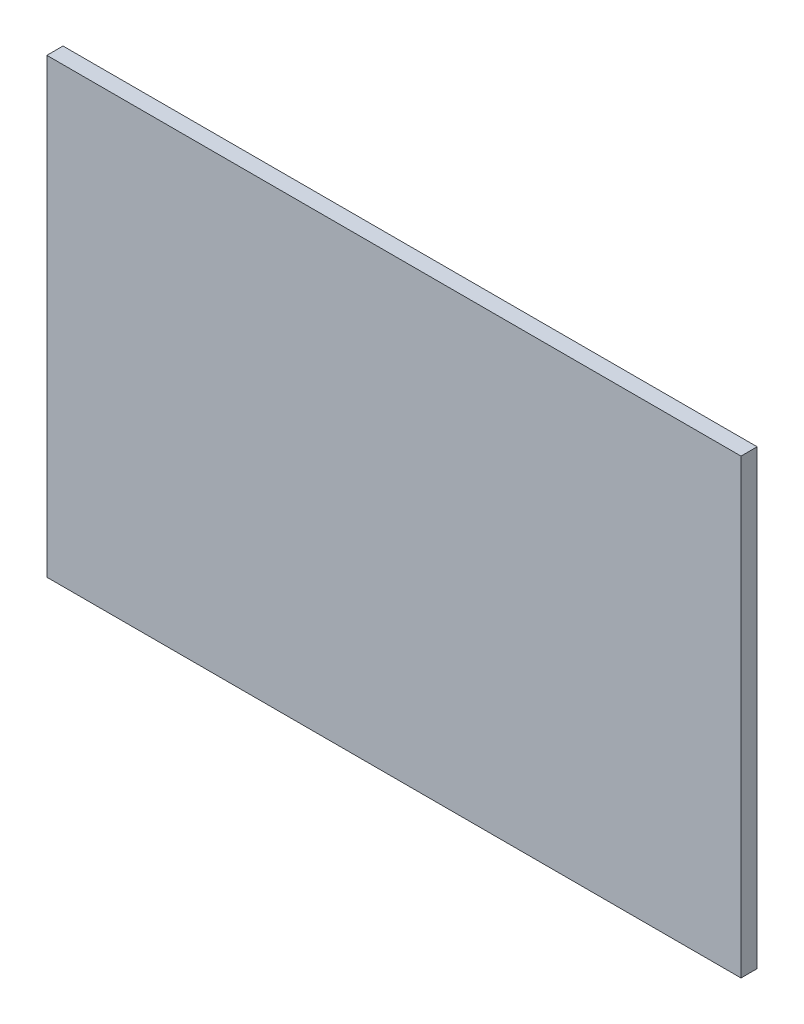
ISO-10303-21;
HEADER;
FILE_DESCRIPTION(('STEP AP214'),'2;1');
FILE_NAME('part.step','',(''),(''),'','','');
FILE_SCHEMA(('AUTOMOTIVE_DESIGN { 1 0 10303 214 1 1 1 1 }'));
ENDSEC;
DATA;
#1=APPLICATION_CONTEXT('core data for automotive mechanical design processes');
#2=APPLICATION_PROTOCOL_DEFINITION('international standard','automotive_design',2000,#1);
#3=PRODUCT_CONTEXT('',#1,'mechanical');
#4=PRODUCT('Part','Part','',(#3));
#5=PRODUCT_RELATED_PRODUCT_CATEGORY('part','',(#4));
#6=PRODUCT_DEFINITION_FORMATION('','',#4);
#7=PRODUCT_DEFINITION_CONTEXT('part definition',#1,'design');
#8=PRODUCT_DEFINITION('design','',#6,#7);
#9=PRODUCT_DEFINITION_SHAPE('','',#8);
#10=(LENGTH_UNIT() NAMED_UNIT(*) SI_UNIT(.MILLI.,.METRE.));
#11=(NAMED_UNIT(*) PLANE_ANGLE_UNIT() SI_UNIT($,.RADIAN.));
#12=(NAMED_UNIT(*) SI_UNIT($,.STERADIAN.) SOLID_ANGLE_UNIT());
#13=UNCERTAINTY_MEASURE_WITH_UNIT(LENGTH_MEASURE(1.E-05),#10,'distance_accuracy_value','');
#14=(GEOMETRIC_REPRESENTATION_CONTEXT(3) GLOBAL_UNCERTAINTY_ASSIGNED_CONTEXT((#13)) GLOBAL_UNIT_ASSIGNED_CONTEXT((#10,
#11,#12)) REPRESENTATION_CONTEXT('',''));
#15=CARTESIAN_POINT('',(0.,0.,0.));
#16=DIRECTION('',(0.,0.,1.));
#17=DIRECTION('',(1.,0.,0.));
#18=AXIS2_PLACEMENT_3D('',#15,#16,#17);
#19=CARTESIAN_POINT('',(0.,0.,0.));
#20=DIRECTION('',(0.,0.,1.));
#21=DIRECTION('',(1.,0.,0.));
#22=AXIS2_PLACEMENT_3D('',#19,#20,#21);
#23=PLANE('',#22);
#24=DIRECTION('',(1.,0.,0.));
#25=VECTOR('',#24,1.);
#26=CARTESIAN_POINT('',(2.15,1.4,0.));
#27=LINE('',#26,#25);
#28=CARTESIAN_POINT('',(2.15,1.4,0.));
#29=VERTEX_POINT('',#28);
#30=CARTESIAN_POINT('',(-2.15,1.4,0.));
#31=VERTEX_POINT('',#30);
#32=EDGE_CURVE('E79',#29,#31,#27,.F.);
#33=ORIENTED_EDGE('',*,*,#32,.F.);
#34=DIRECTION('',(0.,1.,0.));
#35=VECTOR('',#34,1.);
#36=CARTESIAN_POINT('',(2.15,-1.4,0.));
#37=LINE('',#36,#35);
#38=CARTESIAN_POINT('',(2.15,-1.4,0.));
#39=VERTEX_POINT('',#38);
#40=EDGE_CURVE('E55',#39,#29,#37,.T.);
#41=ORIENTED_EDGE('',*,*,#40,.F.);
#42=DIRECTION('',(1.,0.,0.));
#43=VECTOR('',#42,1.);
#44=CARTESIAN_POINT('',(-2.15,-1.4,0.));
#45=LINE('',#44,#43);
#46=CARTESIAN_POINT('',(-2.15,-1.4,0.));
#47=VERTEX_POINT('',#46);
#48=EDGE_CURVE('E57',#47,#39,#45,.T.);
#49=ORIENTED_EDGE('',*,*,#48,.F.);
#50=DIRECTION('',(0.,1.,0.));
#51=VECTOR('',#50,1.);
#52=CARTESIAN_POINT('',(-2.15,1.4,0.));
#53=LINE('',#52,#51);
#54=EDGE_CURVE('E20',#31,#47,#53,.F.);
#55=ORIENTED_EDGE('',*,*,#54,.F.);
#56=EDGE_LOOP('',(#33,#41,#49,#55));
#57=FACE_BOUND('',#56,.T.);
#58=ADVANCED_FACE('F17',(#57),#23,.F.);
#59=CARTESIAN_POINT('',(-2.15,1.4,0.));
#60=DIRECTION('',(-1.,0.,0.));
#61=DIRECTION('',(0.,0.,1.));
#62=AXIS2_PLACEMENT_3D('',#59,#60,#61);
#63=PLANE('',#62);
#64=DIRECTION('',(0.,1.,0.));
#65=VECTOR('',#64,1.);
#66=CARTESIAN_POINT('',(-2.15,0.,0.1));
#67=LINE('',#66,#65);
#68=CARTESIAN_POINT('',(-2.15,1.4,0.1));
#69=VERTEX_POINT('',#68);
#70=CARTESIAN_POINT('',(-2.15,-1.4,0.1));
#71=VERTEX_POINT('',#70);
#72=EDGE_CURVE('E83',#69,#71,#67,.F.);
#73=ORIENTED_EDGE('',*,*,#72,.F.);
#74=DIRECTION('',(0.,0.,1.));
#75=VECTOR('',#74,1.);
#76=CARTESIAN_POINT('',(-2.15,1.4,0.));
#77=LINE('',#76,#75);
#78=EDGE_CURVE('E68',#31,#69,#77,.T.);
#79=ORIENTED_EDGE('',*,*,#78,.F.);
#80=ORIENTED_EDGE('',*,*,#54,.T.);
#81=DIRECTION('',(0.,0.,-1.));
#82=VECTOR('',#81,1.);
#83=CARTESIAN_POINT('',(-2.15,-1.4,0.));
#84=LINE('',#83,#82);
#85=EDGE_CURVE('E63',#71,#47,#84,.T.);
#86=ORIENTED_EDGE('',*,*,#85,.F.);
#87=EDGE_LOOP('',(#73,#79,#80,#86));
#88=FACE_BOUND('',#87,.T.);
#89=ADVANCED_FACE('F65',(#88),#63,.T.);
#90=CARTESIAN_POINT('',(-2.15,-1.4,0.));
#91=DIRECTION('',(0.,-1.,0.));
#92=DIRECTION('',(0.,0.,-1.));
#93=AXIS2_PLACEMENT_3D('',#90,#91,#92);
#94=PLANE('',#93);
#95=DIRECTION('',(1.,0.,0.));
#96=VECTOR('',#95,1.);
#97=CARTESIAN_POINT('',(0.,-1.4,0.1));
#98=LINE('',#97,#96);
#99=CARTESIAN_POINT('',(2.15,-1.4,0.1));
#100=VERTEX_POINT('',#99);
#101=EDGE_CURVE('E72',#71,#100,#98,.T.);
#102=ORIENTED_EDGE('',*,*,#101,.F.);
#103=ORIENTED_EDGE('',*,*,#85,.T.);
#104=ORIENTED_EDGE('',*,*,#48,.T.);
#105=DIRECTION('',(0.,0.,-1.));
#106=VECTOR('',#105,1.);
#107=CARTESIAN_POINT('',(2.15,-1.4,0.));
#108=LINE('',#107,#106);
#109=EDGE_CURVE('E75',#100,#39,#108,.T.);
#110=ORIENTED_EDGE('',*,*,#109,.F.);
#111=EDGE_LOOP('',(#102,#103,#104,#110));
#112=FACE_BOUND('',#111,.T.);
#113=ADVANCED_FACE('F70',(#112),#94,.T.);
#114=CARTESIAN_POINT('',(2.15,-1.4,0.));
#115=DIRECTION('',(1.,0.,0.));
#116=DIRECTION('',(0.,0.,-1.));
#117=AXIS2_PLACEMENT_3D('',#114,#115,#116);
#118=PLANE('',#117);
#119=DIRECTION('',(0.,1.,0.));
#120=VECTOR('',#119,1.);
#121=CARTESIAN_POINT('',(2.15,0.,0.1));
#122=LINE('',#121,#120);
#123=CARTESIAN_POINT('',(2.15,1.4,0.1));
#124=VERTEX_POINT('',#123);
#125=EDGE_CURVE('E26',#100,#124,#122,.T.);
#126=ORIENTED_EDGE('',*,*,#125,.F.);
#127=ORIENTED_EDGE('',*,*,#109,.T.);
#128=ORIENTED_EDGE('',*,*,#40,.T.);
#129=DIRECTION('',(0.,0.,1.));
#130=VECTOR('',#129,1.);
#131=CARTESIAN_POINT('',(2.15,1.4,0.));
#132=LINE('',#131,#130);
#133=EDGE_CURVE('E35',#124,#29,#132,.F.);
#134=ORIENTED_EDGE('',*,*,#133,.F.);
#135=EDGE_LOOP('',(#126,#127,#128,#134));
#136=FACE_BOUND('',#135,.T.);
#137=ADVANCED_FACE('F89',(#136),#118,.T.);
#138=CARTESIAN_POINT('',(2.15,1.4,0.));
#139=DIRECTION('',(0.,1.,0.));
#140=DIRECTION('',(0.,0.,1.));
#141=AXIS2_PLACEMENT_3D('',#138,#139,#140);
#142=PLANE('',#141);
#143=DIRECTION('',(1.,0.,0.));
#144=VECTOR('',#143,1.);
#145=CARTESIAN_POINT('',(0.,1.4,0.1));
#146=LINE('',#145,#144);
#147=EDGE_CURVE('E11',#124,#69,#146,.F.);
#148=ORIENTED_EDGE('',*,*,#147,.F.);
#149=ORIENTED_EDGE('',*,*,#133,.T.);
#150=ORIENTED_EDGE('',*,*,#32,.T.);
#151=ORIENTED_EDGE('',*,*,#78,.T.);
#152=EDGE_LOOP('',(#148,#149,#150,#151));
#153=FACE_BOUND('',#152,.T.);
#154=ADVANCED_FACE('F91',(#153),#142,.T.);
#155=CARTESIAN_POINT('',(0.,0.,0.1));
#156=DIRECTION('',(0.,0.,1.));
#157=DIRECTION('',(1.,0.,0.));
#158=AXIS2_PLACEMENT_3D('',#155,#156,#157);
#159=PLANE('',#158);
#160=ORIENTED_EDGE('',*,*,#125,.T.);
#161=ORIENTED_EDGE('',*,*,#147,.T.);
#162=ORIENTED_EDGE('',*,*,#72,.T.);
#163=ORIENTED_EDGE('',*,*,#101,.T.);
#164=EDGE_LOOP('',(#160,#161,#162,#163));
#165=FACE_BOUND('',#164,.T.);
#166=ADVANCED_FACE('F88',(#165),#159,.T.);
#167=CLOSED_SHELL('',(#58,#89,#113,#137,#154,#166));
#168=MANIFOLD_SOLID_BREP('B1',#167);
#169=ADVANCED_BREP_SHAPE_REPRESENTATION('',(#18,#168),#14);
#170=SHAPE_DEFINITION_REPRESENTATION(#9,#169);
ENDSEC;
END-ISO-10303-21;
